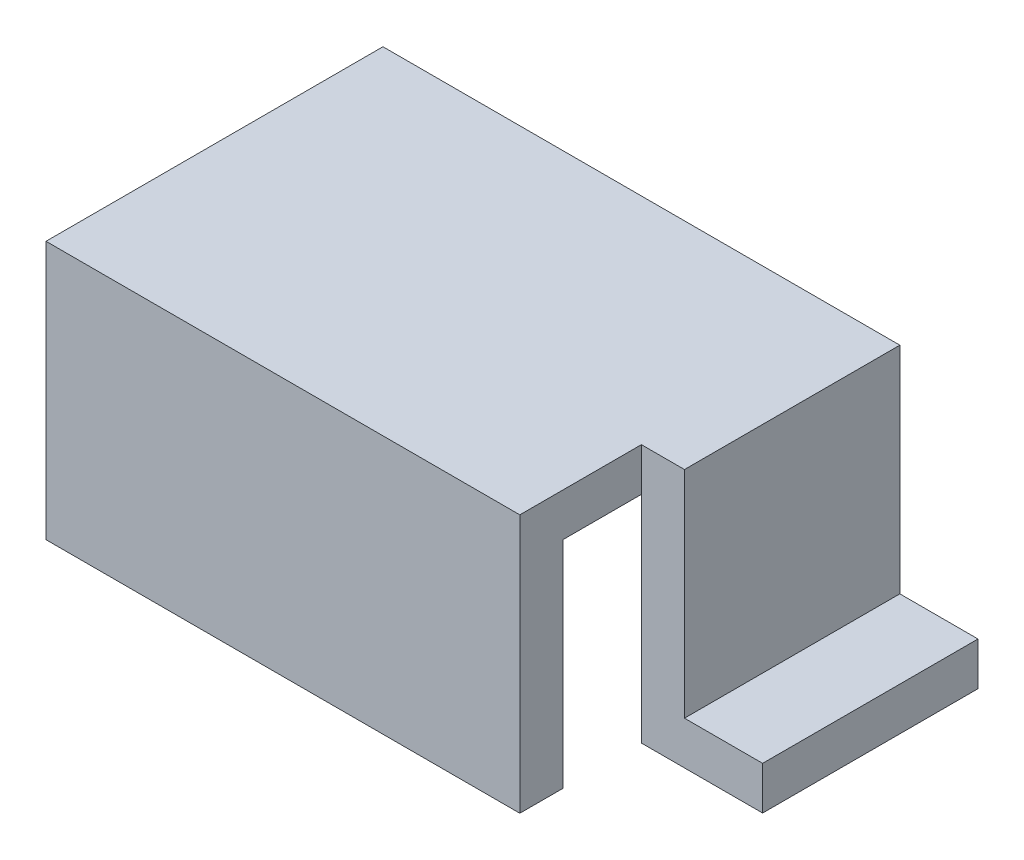
ISO-10303-21;
HEADER;
FILE_DESCRIPTION(('STEP AP214'),'2;1');
FILE_NAME('part.step','',(''),(''),'','','');
FILE_SCHEMA(('AUTOMOTIVE_DESIGN { 1 0 10303 214 1 1 1 1 }'));
ENDSEC;
DATA;
#1=APPLICATION_CONTEXT('core data for automotive mechanical design processes');
#2=APPLICATION_PROTOCOL_DEFINITION('international standard','automotive_design',2000,#1);
#3=PRODUCT_CONTEXT('',#1,'mechanical');
#4=PRODUCT('Part','Part','',(#3));
#5=PRODUCT_RELATED_PRODUCT_CATEGORY('part','',(#4));
#6=PRODUCT_DEFINITION_FORMATION('','',#4);
#7=PRODUCT_DEFINITION_CONTEXT('part definition',#1,'design');
#8=PRODUCT_DEFINITION('design','',#6,#7);
#9=PRODUCT_DEFINITION_SHAPE('','',#8);
#10=(LENGTH_UNIT() NAMED_UNIT(*) SI_UNIT(.MILLI.,.METRE.));
#11=(NAMED_UNIT(*) PLANE_ANGLE_UNIT() SI_UNIT($,.RADIAN.));
#12=(NAMED_UNIT(*) SI_UNIT($,.STERADIAN.) SOLID_ANGLE_UNIT());
#13=UNCERTAINTY_MEASURE_WITH_UNIT(LENGTH_MEASURE(1.E-05),#10,'distance_accuracy_value','');
#14=(GEOMETRIC_REPRESENTATION_CONTEXT(3) GLOBAL_UNCERTAINTY_ASSIGNED_CONTEXT((#13)) GLOBAL_UNIT_ASSIGNED_CONTEXT((#10,
#11,#12)) REPRESENTATION_CONTEXT('',''));
#15=CARTESIAN_POINT('',(0.,0.,0.));
#16=DIRECTION('',(0.,0.,1.));
#17=DIRECTION('',(1.,0.,0.));
#18=AXIS2_PLACEMENT_3D('',#15,#16,#17);
#19=CARTESIAN_POINT('',(0.,0.,20.));
#20=DIRECTION('',(0.,0.,-1.));
#21=DIRECTION('',(-1.,0.,0.));
#22=AXIS2_PLACEMENT_3D('',#19,#20,#21);
#23=PLANE('',#22);
#24=DIRECTION('',(-1.,0.,0.));
#25=VECTOR('',#24,1.);
#26=CARTESIAN_POINT('',(7.25748502994012,24.,20.));
#27=LINE('',#26,#25);
#28=CARTESIAN_POINT('',(55.2574850299401,24.,20.));
#29=VERTEX_POINT('',#28);
#30=CARTESIAN_POINT('',(51.2574850299401,24.,20.));
#31=VERTEX_POINT('',#30);
#32=EDGE_CURVE('E208',#29,#31,#27,.T.);
#33=ORIENTED_EDGE('',*,*,#32,.T.);
#34=DIRECTION('',(0.,1.,0.));
#35=VECTOR('',#34,1.);
#36=CARTESIAN_POINT('',(51.2574850299401,0.,20.));
#37=LINE('',#36,#35);
#38=CARTESIAN_POINT('',(51.2574850299401,20.,20.));
#39=VERTEX_POINT('',#38);
#40=EDGE_CURVE('E177',#39,#31,#37,.T.);
#41=ORIENTED_EDGE('',*,*,#40,.F.);
#42=DIRECTION('',(0.,-1.,0.));
#43=VECTOR('',#42,1.);
#44=CARTESIAN_POINT('',(51.2574850299401,20.,20.));
#45=LINE('',#44,#43);
#46=CARTESIAN_POINT('',(51.2574850299401,0.,20.));
#47=VERTEX_POINT('',#46);
#48=EDGE_CURVE('E198',#39,#47,#45,.T.);
#49=ORIENTED_EDGE('',*,*,#48,.T.);
#50=DIRECTION('',(1.,0.,0.));
#51=VECTOR('',#50,1.);
#52=CARTESIAN_POINT('',(51.2574850299401,0.,20.));
#53=LINE('',#52,#51);
#54=CARTESIAN_POINT('',(62.5149700598802,0.,20.));
#55=VERTEX_POINT('',#54);
#56=EDGE_CURVE('E200',#47,#55,#53,.T.);
#57=ORIENTED_EDGE('',*,*,#56,.T.);
#58=DIRECTION('',(0.,1.,0.));
#59=VECTOR('',#58,1.);
#60=CARTESIAN_POINT('',(62.5149700598802,0.,20.));
#61=LINE('',#60,#59);
#62=CARTESIAN_POINT('',(62.5149700598802,4.,20.));
#63=VERTEX_POINT('',#62);
#64=EDGE_CURVE('E202',#55,#63,#61,.T.);
#65=ORIENTED_EDGE('',*,*,#64,.T.);
#66=DIRECTION('',(-1.,0.,0.));
#67=VECTOR('',#66,1.);
#68=CARTESIAN_POINT('',(55.2574850299401,4.,20.));
#69=LINE('',#68,#67);
#70=CARTESIAN_POINT('',(55.2574850299401,4.,20.));
#71=VERTEX_POINT('',#70);
#72=EDGE_CURVE('E204',#63,#71,#69,.T.);
#73=ORIENTED_EDGE('',*,*,#72,.T.);
#74=DIRECTION('',(0.,1.,0.));
#75=VECTOR('',#74,1.);
#76=CARTESIAN_POINT('',(55.2574850299401,24.,20.));
#77=LINE('',#76,#75);
#78=EDGE_CURVE('E206',#71,#29,#77,.T.);
#79=ORIENTED_EDGE('',*,*,#78,.T.);
#80=EDGE_LOOP('',(#33,#41,#49,#57,#65,#73,#79));
#81=FACE_BOUND('',#80,.T.);
#82=ADVANCED_FACE('F35',(#81),#23,.F.);
#83=CARTESIAN_POINT('',(0.,0.,20.));
#84=DIRECTION('',(1.,0.,0.));
#85=DIRECTION('',(0.,0.,-1.));
#86=AXIS2_PLACEMENT_3D('',#83,#84,#85);
#87=PLANE('',#86);
#88=DIRECTION('',(0.,-1.,0.));
#89=VECTOR('',#88,1.);
#90=CARTESIAN_POINT('',(0.,0.,0.));
#91=LINE('',#90,#89);
#92=CARTESIAN_POINT('',(0.,4.,0.));
#93=VERTEX_POINT('',#92);
#94=CARTESIAN_POINT('',(0.,0.,0.));
#95=VERTEX_POINT('',#94);
#96=EDGE_CURVE('E189',#93,#95,#91,.T.);
#97=ORIENTED_EDGE('',*,*,#96,.T.);
#98=DIRECTION('',(0.,0.,-1.));
#99=VECTOR('',#98,1.);
#100=CARTESIAN_POINT('',(0.,0.,20.));
#101=LINE('',#100,#99);
#102=CARTESIAN_POINT('',(0.,0.,20.));
#103=VERTEX_POINT('',#102);
#104=EDGE_CURVE('E11',#103,#95,#101,.T.);
#105=ORIENTED_EDGE('',*,*,#104,.F.);
#106=DIRECTION('',(0.,-1.,0.));
#107=VECTOR('',#106,1.);
#108=CARTESIAN_POINT('',(0.,0.,20.));
#109=LINE('',#108,#107);
#110=CARTESIAN_POINT('',(0.,4.,20.));
#111=VERTEX_POINT('',#110);
#112=EDGE_CURVE('E191',#111,#103,#109,.T.);
#113=ORIENTED_EDGE('',*,*,#112,.F.);
#114=DIRECTION('',(0.,0.,-1.));
#115=VECTOR('',#114,1.);
#116=CARTESIAN_POINT('',(0.,4.,20.));
#117=LINE('',#116,#115);
#118=EDGE_CURVE('E212',#111,#93,#117,.T.);
#119=ORIENTED_EDGE('',*,*,#118,.T.);
#120=EDGE_LOOP('',(#97,#105,#113,#119));
#121=FACE_BOUND('',#120,.T.);
#122=ADVANCED_FACE('F37',(#121),#87,.F.);
#123=CARTESIAN_POINT('',(0.,0.,20.));
#124=DIRECTION('',(0.,1.,0.));
#125=DIRECTION('',(0.,0.,1.));
#126=AXIS2_PLACEMENT_3D('',#123,#124,#125);
#127=PLANE('',#126);
#128=DIRECTION('',(0.,0.,-1.));
#129=VECTOR('',#128,1.);
#130=CARTESIAN_POINT('',(11.2574850299401,0.,20.));
#131=LINE('',#130,#129);
#132=CARTESIAN_POINT('',(11.2574850299401,0.,27.29));
#133=VERTEX_POINT('',#132);
#134=CARTESIAN_POINT('',(11.2574850299401,0.,0.));
#135=VERTEX_POINT('',#134);
#136=EDGE_CURVE('E43',#133,#135,#131,.T.);
#137=ORIENTED_EDGE('',*,*,#136,.F.);
#138=DIRECTION('',(-1.,0.,0.));
#139=VECTOR('',#138,1.);
#140=CARTESIAN_POINT('',(77.7803826846082,0.,27.29));
#141=LINE('',#140,#139);
#142=CARTESIAN_POINT('',(51.2574850299401,0.,27.29));
#143=VERTEX_POINT('',#142);
#144=EDGE_CURVE('E168',#143,#133,#141,.T.);
#145=ORIENTED_EDGE('',*,*,#144,.F.);
#146=DIRECTION('',(0.,0.,1.));
#147=VECTOR('',#146,1.);
#148=CARTESIAN_POINT('',(51.2574850299401,0.,0.));
#149=LINE('',#148,#147);
#150=CARTESIAN_POINT('',(51.2574850299401,0.,31.29));
#151=VERTEX_POINT('',#150);
#152=EDGE_CURVE('E159',#143,#151,#149,.T.);
#153=ORIENTED_EDGE('',*,*,#152,.T.);
#154=DIRECTION('',(-1.,0.,0.));
#155=VECTOR('',#154,1.);
#156=CARTESIAN_POINT('',(37.7803826846082,0.,31.29));
#157=LINE('',#156,#155);
#158=CARTESIAN_POINT('',(7.25748502994012,0.,31.29));
#159=VERTEX_POINT('',#158);
#160=EDGE_CURVE('E143',#151,#159,#157,.T.);
#161=ORIENTED_EDGE('',*,*,#160,.T.);
#162=DIRECTION('',(0.,0.,-1.));
#163=VECTOR('',#162,1.);
#164=CARTESIAN_POINT('',(7.25748502994012,0.,0.));
#165=LINE('',#164,#163);
#166=CARTESIAN_POINT('',(7.25748502994012,0.,20.));
#167=VERTEX_POINT('',#166);
#168=EDGE_CURVE('E184',#159,#167,#165,.T.);
#169=ORIENTED_EDGE('',*,*,#168,.T.);
#170=DIRECTION('',(1.,0.,0.));
#171=VECTOR('',#170,1.);
#172=CARTESIAN_POINT('',(0.,0.,20.));
#173=LINE('',#172,#171);
#174=EDGE_CURVE('E194',#103,#167,#173,.T.);
#175=ORIENTED_EDGE('',*,*,#174,.F.);
#176=ORIENTED_EDGE('',*,*,#104,.T.);
#177=DIRECTION('',(1.,0.,0.));
#178=VECTOR('',#177,1.);
#179=CARTESIAN_POINT('',(0.,0.,0.));
#180=LINE('',#179,#178);
#181=EDGE_CURVE('E215',#95,#135,#180,.T.);
#182=ORIENTED_EDGE('',*,*,#181,.T.);
#183=EDGE_LOOP('',(#137,#145,#153,#161,#169,#175,#176,#182));
#184=FACE_BOUND('',#183,.T.);
#185=ADVANCED_FACE('F166',(#184),#127,.F.);
#186=CARTESIAN_POINT('',(11.2574850299401,0.,20.));
#187=DIRECTION('',(-1.,0.,0.));
#188=DIRECTION('',(0.,0.,1.));
#189=AXIS2_PLACEMENT_3D('',#186,#187,#188);
#190=PLANE('',#189);
#191=DIRECTION('',(0.,0.,-1.));
#192=VECTOR('',#191,1.);
#193=CARTESIAN_POINT('',(11.2574850299401,20.,20.));
#194=LINE('',#193,#192);
#195=CARTESIAN_POINT('',(11.2574850299401,20.,27.29));
#196=VERTEX_POINT('',#195);
#197=CARTESIAN_POINT('',(11.2574850299401,20.,0.));
#198=VERTEX_POINT('',#197);
#199=EDGE_CURVE('E50',#196,#198,#194,.T.);
#200=ORIENTED_EDGE('',*,*,#199,.F.);
#201=DIRECTION('',(0.,-1.,0.));
#202=VECTOR('',#201,1.);
#203=CARTESIAN_POINT('',(11.2574850299401,0.,27.29));
#204=LINE('',#203,#202);
#205=EDGE_CURVE('E54',#196,#133,#204,.T.);
#206=ORIENTED_EDGE('',*,*,#205,.T.);
#207=ORIENTED_EDGE('',*,*,#136,.T.);
#208=DIRECTION('',(0.,1.,0.));
#209=VECTOR('',#208,1.);
#210=CARTESIAN_POINT('',(11.2574850299401,0.,0.));
#211=LINE('',#210,#209);
#212=EDGE_CURVE('E218',#135,#198,#211,.T.);
#213=ORIENTED_EDGE('',*,*,#212,.T.);
#214=EDGE_LOOP('',(#200,#206,#207,#213));
#215=FACE_BOUND('',#214,.T.);
#216=ADVANCED_FACE('F263',(#215),#190,.F.);
#217=CARTESIAN_POINT('',(11.2574850299401,20.,20.));
#218=DIRECTION('',(0.,1.,0.));
#219=DIRECTION('',(0.,0.,1.));
#220=AXIS2_PLACEMENT_3D('',#217,#218,#219);
#221=PLANE('',#220);
#222=DIRECTION('',(1.,0.,0.));
#223=VECTOR('',#222,1.);
#224=CARTESIAN_POINT('',(11.2574850299401,20.,0.));
#225=LINE('',#224,#223);
#226=CARTESIAN_POINT('',(51.2574850299401,20.,0.));
#227=VERTEX_POINT('',#226);
#228=EDGE_CURVE('E220',#198,#227,#225,.T.);
#229=ORIENTED_EDGE('',*,*,#228,.T.);
#230=DIRECTION('',(0.,0.,-1.));
#231=VECTOR('',#230,1.);
#232=CARTESIAN_POINT('',(51.2574850299401,20.,20.));
#233=LINE('',#232,#231);
#234=EDGE_CURVE('E260',#39,#227,#233,.T.);
#235=ORIENTED_EDGE('',*,*,#234,.F.);
#236=DIRECTION('',(0.,0.,1.));
#237=VECTOR('',#236,1.);
#238=CARTESIAN_POINT('',(51.2574850299401,20.,0.));
#239=LINE('',#238,#237);
#240=CARTESIAN_POINT('',(51.2574850299401,20.,27.29));
#241=VERTEX_POINT('',#240);
#242=EDGE_CURVE('E169',#39,#241,#239,.T.);
#243=ORIENTED_EDGE('',*,*,#242,.T.);
#244=DIRECTION('',(-1.,0.,0.));
#245=VECTOR('',#244,1.);
#246=CARTESIAN_POINT('',(77.7803826846082,20.,27.29));
#247=LINE('',#246,#245);
#248=EDGE_CURVE('E172',#241,#196,#247,.T.);
#249=ORIENTED_EDGE('',*,*,#248,.T.);
#250=ORIENTED_EDGE('',*,*,#199,.T.);
#251=EDGE_LOOP('',(#229,#235,#243,#249,#250));
#252=FACE_BOUND('',#251,.T.);
#253=ADVANCED_FACE('F274',(#252),#221,.F.);
#254=CARTESIAN_POINT('',(51.2574850299401,20.,20.));
#255=DIRECTION('',(1.,0.,0.));
#256=DIRECTION('',(0.,1.,0.));
#257=AXIS2_PLACEMENT_3D('',#254,#255,#256);
#258=PLANE('',#257);
#259=DIRECTION('',(0.,-1.,0.));
#260=VECTOR('',#259,1.);
#261=CARTESIAN_POINT('',(51.2574850299401,20.,0.));
#262=LINE('',#261,#260);
#263=CARTESIAN_POINT('',(51.2574850299401,0.,0.));
#264=VERTEX_POINT('',#263);
#265=EDGE_CURVE('E222',#227,#264,#262,.T.);
#266=ORIENTED_EDGE('',*,*,#265,.T.);
#267=DIRECTION('',(0.,0.,-1.));
#268=VECTOR('',#267,1.);
#269=CARTESIAN_POINT('',(51.2574850299401,0.,20.));
#270=LINE('',#269,#268);
#271=EDGE_CURVE('E257',#47,#264,#270,.T.);
#272=ORIENTED_EDGE('',*,*,#271,.F.);
#273=ORIENTED_EDGE('',*,*,#48,.F.);
#274=ORIENTED_EDGE('',*,*,#234,.T.);
#275=EDGE_LOOP('',(#266,#272,#273,#274));
#276=FACE_BOUND('',#275,.T.);
#277=ADVANCED_FACE('F277',(#276),#258,.F.);
#278=CARTESIAN_POINT('',(51.2574850299401,0.,20.));
#279=DIRECTION('',(0.,1.,0.));
#280=DIRECTION('',(0.,0.,1.));
#281=AXIS2_PLACEMENT_3D('',#278,#279,#280);
#282=PLANE('',#281);
#283=DIRECTION('',(1.,0.,0.));
#284=VECTOR('',#283,1.);
#285=CARTESIAN_POINT('',(51.2574850299401,0.,0.));
#286=LINE('',#285,#284);
#287=CARTESIAN_POINT('',(62.5149700598802,0.,0.));
#288=VERTEX_POINT('',#287);
#289=EDGE_CURVE('E224',#264,#288,#286,.T.);
#290=ORIENTED_EDGE('',*,*,#289,.T.);
#291=DIRECTION('',(0.,0.,-1.));
#292=VECTOR('',#291,1.);
#293=CARTESIAN_POINT('',(62.5149700598802,0.,20.));
#294=LINE('',#293,#292);
#295=EDGE_CURVE('E254',#55,#288,#294,.T.);
#296=ORIENTED_EDGE('',*,*,#295,.F.);
#297=ORIENTED_EDGE('',*,*,#56,.F.);
#298=ORIENTED_EDGE('',*,*,#271,.T.);
#299=EDGE_LOOP('',(#290,#296,#297,#298));
#300=FACE_BOUND('',#299,.T.);
#301=ADVANCED_FACE('F339',(#300),#282,.F.);
#302=CARTESIAN_POINT('',(62.5149700598802,0.,20.));
#303=DIRECTION('',(-1.,0.,0.));
#304=DIRECTION('',(0.,0.,1.));
#305=AXIS2_PLACEMENT_3D('',#302,#303,#304);
#306=PLANE('',#305);
#307=DIRECTION('',(0.,1.,0.));
#308=VECTOR('',#307,1.);
#309=CARTESIAN_POINT('',(62.5149700598802,0.,0.));
#310=LINE('',#309,#308);
#311=CARTESIAN_POINT('',(62.5149700598802,4.,0.));
#312=VERTEX_POINT('',#311);
#313=EDGE_CURVE('E226',#288,#312,#310,.T.);
#314=ORIENTED_EDGE('',*,*,#313,.T.);
#315=DIRECTION('',(0.,0.,-1.));
#316=VECTOR('',#315,1.);
#317=CARTESIAN_POINT('',(62.5149700598802,4.,20.));
#318=LINE('',#317,#316);
#319=EDGE_CURVE('E251',#63,#312,#318,.T.);
#320=ORIENTED_EDGE('',*,*,#319,.F.);
#321=ORIENTED_EDGE('',*,*,#64,.F.);
#322=ORIENTED_EDGE('',*,*,#295,.T.);
#323=EDGE_LOOP('',(#314,#320,#321,#322));
#324=FACE_BOUND('',#323,.T.);
#325=ADVANCED_FACE('F335',(#324),#306,.F.);
#326=CARTESIAN_POINT('',(55.2574850299401,4.,20.));
#327=DIRECTION('',(0.,-1.,0.));
#328=DIRECTION('',(0.,0.,-1.));
#329=AXIS2_PLACEMENT_3D('',#326,#327,#328);
#330=PLANE('',#329);
#331=DIRECTION('',(-1.,0.,0.));
#332=VECTOR('',#331,1.);
#333=CARTESIAN_POINT('',(55.2574850299401,4.,0.));
#334=LINE('',#333,#332);
#335=CARTESIAN_POINT('',(55.2574850299401,4.,0.));
#336=VERTEX_POINT('',#335);
#337=EDGE_CURVE('E228',#312,#336,#334,.T.);
#338=ORIENTED_EDGE('',*,*,#337,.T.);
#339=DIRECTION('',(0.,0.,-1.));
#340=VECTOR('',#339,1.);
#341=CARTESIAN_POINT('',(55.2574850299401,4.,20.));
#342=LINE('',#341,#340);
#343=EDGE_CURVE('E248',#71,#336,#342,.T.);
#344=ORIENTED_EDGE('',*,*,#343,.F.);
#345=ORIENTED_EDGE('',*,*,#72,.F.);
#346=ORIENTED_EDGE('',*,*,#319,.T.);
#347=EDGE_LOOP('',(#338,#344,#345,#346));
#348=FACE_BOUND('',#347,.T.);
#349=ADVANCED_FACE('F331',(#348),#330,.F.);
#350=CARTESIAN_POINT('',(55.2574850299401,24.,20.));
#351=DIRECTION('',(-1.,0.,0.));
#352=DIRECTION('',(0.,0.,1.));
#353=AXIS2_PLACEMENT_3D('',#350,#351,#352);
#354=PLANE('',#353);
#355=DIRECTION('',(0.,1.,0.));
#356=VECTOR('',#355,1.);
#357=CARTESIAN_POINT('',(55.2574850299401,24.,0.));
#358=LINE('',#357,#356);
#359=CARTESIAN_POINT('',(55.2574850299401,24.,0.));
#360=VERTEX_POINT('',#359);
#361=EDGE_CURVE('E230',#336,#360,#358,.T.);
#362=ORIENTED_EDGE('',*,*,#361,.T.);
#363=DIRECTION('',(0.,0.,-1.));
#364=VECTOR('',#363,1.);
#365=CARTESIAN_POINT('',(55.2574850299401,24.,20.));
#366=LINE('',#365,#364);
#367=EDGE_CURVE('E245',#29,#360,#366,.T.);
#368=ORIENTED_EDGE('',*,*,#367,.F.);
#369=ORIENTED_EDGE('',*,*,#78,.F.);
#370=ORIENTED_EDGE('',*,*,#343,.T.);
#371=EDGE_LOOP('',(#362,#368,#369,#370));
#372=FACE_BOUND('',#371,.T.);
#373=ADVANCED_FACE('F327',(#372),#354,.F.);
#374=CARTESIAN_POINT('',(7.25748502994012,24.,20.));
#375=DIRECTION('',(0.,-1.,0.));
#376=DIRECTION('',(0.,0.,-1.));
#377=AXIS2_PLACEMENT_3D('',#374,#375,#376);
#378=PLANE('',#377);
#379=DIRECTION('',(-1.,0.,0.));
#380=VECTOR('',#379,1.);
#381=CARTESIAN_POINT('',(37.7803826846082,24.,31.29));
#382=LINE('',#381,#380);
#383=CARTESIAN_POINT('',(51.2574850299401,24.,31.29));
#384=VERTEX_POINT('',#383);
#385=CARTESIAN_POINT('',(7.25748502994012,24.,31.29));
#386=VERTEX_POINT('',#385);
#387=EDGE_CURVE('E153',#384,#386,#382,.T.);
#388=ORIENTED_EDGE('',*,*,#387,.F.);
#389=DIRECTION('',(0.,0.,1.));
#390=VECTOR('',#389,1.);
#391=CARTESIAN_POINT('',(51.2574850299401,24.,0.));
#392=LINE('',#391,#390);
#393=EDGE_CURVE('E163',#31,#384,#392,.T.);
#394=ORIENTED_EDGE('',*,*,#393,.F.);
#395=ORIENTED_EDGE('',*,*,#32,.F.);
#396=ORIENTED_EDGE('',*,*,#367,.T.);
#397=DIRECTION('',(-1.,0.,0.));
#398=VECTOR('',#397,1.);
#399=CARTESIAN_POINT('',(7.25748502994012,24.,0.));
#400=LINE('',#399,#398);
#401=CARTESIAN_POINT('',(7.25748502994012,24.,0.));
#402=VERTEX_POINT('',#401);
#403=EDGE_CURVE('E232',#360,#402,#400,.T.);
#404=ORIENTED_EDGE('',*,*,#403,.T.);
#405=DIRECTION('',(0.,0.,-1.));
#406=VECTOR('',#405,1.);
#407=CARTESIAN_POINT('',(7.25748502994012,24.,20.));
#408=LINE('',#407,#406);
#409=EDGE_CURVE('E243',#386,#402,#408,.T.);
#410=ORIENTED_EDGE('',*,*,#409,.F.);
#411=EDGE_LOOP('',(#388,#394,#395,#396,#404,#410));
#412=FACE_BOUND('',#411,.T.);
#413=ADVANCED_FACE('F322',(#412),#378,.F.);
#414=CARTESIAN_POINT('',(7.25748502994012,4.,20.));
#415=DIRECTION('',(1.,0.,0.));
#416=DIRECTION('',(0.,0.,-1.));
#417=AXIS2_PLACEMENT_3D('',#414,#415,#416);
#418=PLANE('',#417);
#419=ORIENTED_EDGE('',*,*,#409,.T.);
#420=DIRECTION('',(0.,-1.,0.));
#421=VECTOR('',#420,1.);
#422=CARTESIAN_POINT('',(7.25748502994012,4.,0.));
#423=LINE('',#422,#421);
#424=CARTESIAN_POINT('',(7.25748502994012,4.,0.));
#425=VERTEX_POINT('',#424);
#426=EDGE_CURVE('E235',#402,#425,#423,.T.);
#427=ORIENTED_EDGE('',*,*,#426,.T.);
#428=DIRECTION('',(0.,0.,-1.));
#429=VECTOR('',#428,1.);
#430=CARTESIAN_POINT('',(7.25748502994012,4.,20.));
#431=LINE('',#430,#429);
#432=CARTESIAN_POINT('',(7.25748502994012,4.,20.));
#433=VERTEX_POINT('',#432);
#434=EDGE_CURVE('E240',#433,#425,#431,.T.);
#435=ORIENTED_EDGE('',*,*,#434,.F.);
#436=DIRECTION('',(0.,1.,0.));
#437=VECTOR('',#436,1.);
#438=CARTESIAN_POINT('',(7.25748502994012,0.,20.));
#439=LINE('',#438,#437);
#440=EDGE_CURVE('E154',#167,#433,#439,.T.);
#441=ORIENTED_EDGE('',*,*,#440,.F.);
#442=ORIENTED_EDGE('',*,*,#168,.F.);
#443=DIRECTION('',(0.,-1.,0.));
#444=VECTOR('',#443,1.);
#445=CARTESIAN_POINT('',(7.25748502994012,0.,31.29));
#446=LINE('',#445,#444);
#447=EDGE_CURVE('E149',#386,#159,#446,.T.);
#448=ORIENTED_EDGE('',*,*,#447,.F.);
#449=EDGE_LOOP('',(#419,#427,#435,#441,#442,#448));
#450=FACE_BOUND('',#449,.T.);
#451=ADVANCED_FACE('F308',(#450),#418,.F.);
#452=CARTESIAN_POINT('',(0.,4.,20.));
#453=DIRECTION('',(0.,-1.,0.));
#454=DIRECTION('',(0.,0.,-1.));
#455=AXIS2_PLACEMENT_3D('',#452,#453,#454);
#456=PLANE('',#455);
#457=DIRECTION('',(-1.,0.,0.));
#458=VECTOR('',#457,1.);
#459=CARTESIAN_POINT('',(0.,4.,0.));
#460=LINE('',#459,#458);
#461=EDGE_CURVE('E195',#425,#93,#460,.T.);
#462=ORIENTED_EDGE('',*,*,#461,.T.);
#463=ORIENTED_EDGE('',*,*,#118,.F.);
#464=DIRECTION('',(-1.,0.,0.));
#465=VECTOR('',#464,1.);
#466=CARTESIAN_POINT('',(0.,4.,20.));
#467=LINE('',#466,#465);
#468=EDGE_CURVE('E210',#433,#111,#467,.T.);
#469=ORIENTED_EDGE('',*,*,#468,.F.);
#470=ORIENTED_EDGE('',*,*,#434,.T.);
#471=EDGE_LOOP('',(#462,#463,#469,#470));
#472=FACE_BOUND('',#471,.T.);
#473=ADVANCED_FACE('F302',(#472),#456,.F.);
#474=ORIENTED_EDGE('',*,*,#174,.T.);
#475=ORIENTED_EDGE('',*,*,#440,.T.);
#476=ORIENTED_EDGE('',*,*,#468,.T.);
#477=ORIENTED_EDGE('',*,*,#112,.T.);
#478=EDGE_LOOP('',(#474,#475,#476,#477));
#479=FACE_BOUND('',#478,.T.);
#480=ADVANCED_FACE('F295',(#479),#23,.F.);
#481=CARTESIAN_POINT('',(0.,0.,0.));
#482=DIRECTION('',(0.,0.,-1.));
#483=DIRECTION('',(-1.,0.,0.));
#484=AXIS2_PLACEMENT_3D('',#481,#482,#483);
#485=PLANE('',#484);
#486=ORIENTED_EDGE('',*,*,#96,.F.);
#487=ORIENTED_EDGE('',*,*,#461,.F.);
#488=ORIENTED_EDGE('',*,*,#426,.F.);
#489=ORIENTED_EDGE('',*,*,#403,.F.);
#490=ORIENTED_EDGE('',*,*,#361,.F.);
#491=ORIENTED_EDGE('',*,*,#337,.F.);
#492=ORIENTED_EDGE('',*,*,#313,.F.);
#493=ORIENTED_EDGE('',*,*,#289,.F.);
#494=ORIENTED_EDGE('',*,*,#265,.F.);
#495=ORIENTED_EDGE('',*,*,#228,.F.);
#496=ORIENTED_EDGE('',*,*,#212,.F.);
#497=ORIENTED_EDGE('',*,*,#181,.F.);
#498=EDGE_LOOP('',(#486,#487,#488,#489,#490,#491,#492,#493,#494,#495,#496,#497));
#499=FACE_BOUND('',#498,.T.);
#500=ADVANCED_FACE('F269',(#499),#485,.T.);
#501=CARTESIAN_POINT('',(37.7803826846082,0.,31.29));
#502=DIRECTION('',(0.,0.,-1.));
#503=DIRECTION('',(-1.,0.,0.));
#504=AXIS2_PLACEMENT_3D('',#501,#502,#503);
#505=PLANE('',#504);
#506=ORIENTED_EDGE('',*,*,#160,.F.);
#507=DIRECTION('',(0.,-1.,0.));
#508=VECTOR('',#507,1.);
#509=CARTESIAN_POINT('',(51.2574850299401,0.,31.29));
#510=LINE('',#509,#508);
#511=EDGE_CURVE('E147',#384,#151,#510,.T.);
#512=ORIENTED_EDGE('',*,*,#511,.F.);
#513=ORIENTED_EDGE('',*,*,#387,.T.);
#514=ORIENTED_EDGE('',*,*,#447,.T.);
#515=EDGE_LOOP('',(#506,#512,#513,#514));
#516=FACE_BOUND('',#515,.T.);
#517=ADVANCED_FACE('F145',(#516),#505,.F.);
#518=CARTESIAN_POINT('',(77.7803826846082,0.,27.29));
#519=DIRECTION('',(0.,0.,-1.));
#520=DIRECTION('',(0.,1.,0.));
#521=AXIS2_PLACEMENT_3D('',#518,#519,#520);
#522=PLANE('',#521);
#523=ORIENTED_EDGE('',*,*,#205,.F.);
#524=ORIENTED_EDGE('',*,*,#248,.F.);
#525=DIRECTION('',(0.,-1.,0.));
#526=VECTOR('',#525,1.);
#527=CARTESIAN_POINT('',(51.2574850299401,0.,27.29));
#528=LINE('',#527,#526);
#529=EDGE_CURVE('E175',#241,#143,#528,.T.);
#530=ORIENTED_EDGE('',*,*,#529,.T.);
#531=ORIENTED_EDGE('',*,*,#144,.T.);
#532=EDGE_LOOP('',(#523,#524,#530,#531));
#533=FACE_BOUND('',#532,.T.);
#534=ADVANCED_FACE('F284',(#533),#522,.T.);
#535=CARTESIAN_POINT('',(51.2574850299401,20.,20.));
#536=DIRECTION('',(1.,0.,0.));
#537=DIRECTION('',(0.,1.,0.));
#538=AXIS2_PLACEMENT_3D('',#535,#536,#537);
#539=PLANE('',#538);
#540=ORIENTED_EDGE('',*,*,#529,.F.);
#541=ORIENTED_EDGE('',*,*,#242,.F.);
#542=ORIENTED_EDGE('',*,*,#40,.T.);
#543=ORIENTED_EDGE('',*,*,#393,.T.);
#544=ORIENTED_EDGE('',*,*,#511,.T.);
#545=ORIENTED_EDGE('',*,*,#152,.F.);
#546=EDGE_LOOP('',(#540,#541,#542,#543,#544,#545));
#547=FACE_BOUND('',#546,.T.);
#548=ADVANCED_FACE('F158',(#547),#539,.T.);
#549=CLOSED_SHELL('',(#82,#122,#185,#216,#253,#277,#301,#325,#349,#373,#413,#451,#473,#480,#500,
#517,#534,#548));
#550=MANIFOLD_SOLID_BREP('B2',#549);
#551=ADVANCED_BREP_SHAPE_REPRESENTATION('',(#18,#550),#14);
#552=SHAPE_DEFINITION_REPRESENTATION(#9,#551);
ENDSEC;
END-ISO-10303-21;
